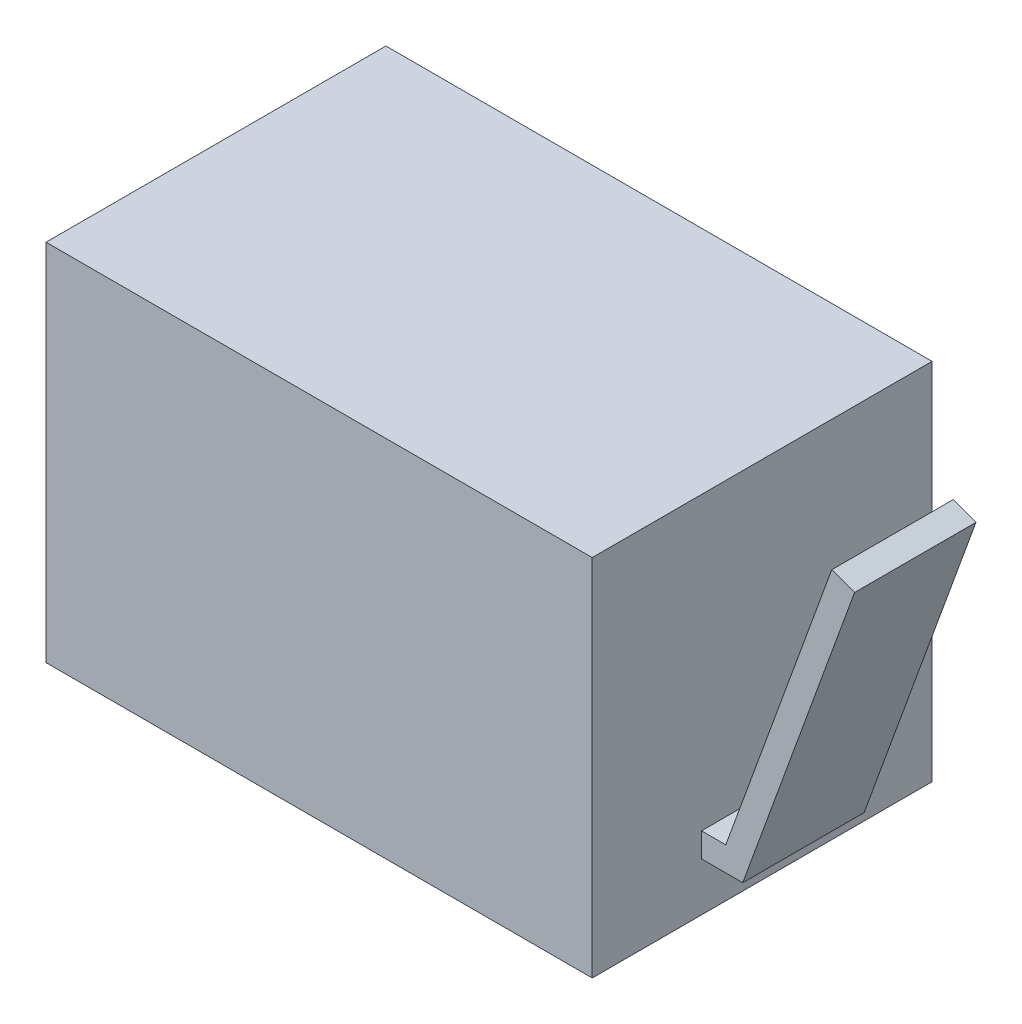
ISO-10303-21;
HEADER;
FILE_DESCRIPTION(('STEP AP214'),'2;1');
FILE_NAME('part.step','',(''),(''),'','','');
FILE_SCHEMA(('AUTOMOTIVE_DESIGN { 1 0 10303 214 1 1 1 1 }'));
ENDSEC;
DATA;
#1=APPLICATION_CONTEXT('core data for automotive mechanical design processes');
#2=APPLICATION_PROTOCOL_DEFINITION('international standard','automotive_design',2000,#1);
#3=PRODUCT_CONTEXT('',#1,'mechanical');
#4=PRODUCT('Part','Part','',(#3));
#5=PRODUCT_RELATED_PRODUCT_CATEGORY('part','',(#4));
#6=PRODUCT_DEFINITION_FORMATION('','',#4);
#7=PRODUCT_DEFINITION_CONTEXT('part definition',#1,'design');
#8=PRODUCT_DEFINITION('design','',#6,#7);
#9=PRODUCT_DEFINITION_SHAPE('','',#8);
#10=(LENGTH_UNIT() NAMED_UNIT(*) SI_UNIT(.MILLI.,.METRE.));
#11=(NAMED_UNIT(*) PLANE_ANGLE_UNIT() SI_UNIT($,.RADIAN.));
#12=(NAMED_UNIT(*) SI_UNIT($,.STERADIAN.) SOLID_ANGLE_UNIT());
#13=UNCERTAINTY_MEASURE_WITH_UNIT(LENGTH_MEASURE(1.E-05),#10,'distance_accuracy_value','');
#14=(GEOMETRIC_REPRESENTATION_CONTEXT(3) GLOBAL_UNCERTAINTY_ASSIGNED_CONTEXT((#13)) GLOBAL_UNIT_ASSIGNED_CONTEXT((#10,
#11,#12)) REPRESENTATION_CONTEXT('',''));
#15=CARTESIAN_POINT('',(0.,0.,0.));
#16=DIRECTION('',(0.,0.,1.));
#17=DIRECTION('',(1.,0.,0.));
#18=AXIS2_PLACEMENT_3D('',#15,#16,#17);
#19=CARTESIAN_POINT('',(22.5,30.,-14.));
#20=DIRECTION('',(-1.,0.,0.));
#21=DIRECTION('',(0.,0.,1.));
#22=AXIS2_PLACEMENT_3D('',#19,#20,#21);
#23=PLANE('',#22);
#24=DIRECTION('',(0.,0.,-1.));
#25=VECTOR('',#24,1.);
#26=CARTESIAN_POINT('',(22.5,0.,-14.));
#27=LINE('',#26,#25);
#28=CARTESIAN_POINT('',(22.5,0.,14.));
#29=VERTEX_POINT('',#28);
#30=CARTESIAN_POINT('',(22.5,0.,-14.));
#31=VERTEX_POINT('',#30);
#32=EDGE_CURVE('E155',#29,#31,#27,.T.);
#33=ORIENTED_EDGE('',*,*,#32,.T.);
#34=DIRECTION('',(0.,-1.,0.));
#35=VECTOR('',#34,1.);
#36=CARTESIAN_POINT('',(22.5,30.,-14.));
#37=LINE('',#36,#35);
#38=CARTESIAN_POINT('',(22.5,30.,-14.));
#39=VERTEX_POINT('',#38);
#40=EDGE_CURVE('E11',#39,#31,#37,.T.);
#41=ORIENTED_EDGE('',*,*,#40,.F.);
#42=DIRECTION('',(0.,0.,-1.));
#43=VECTOR('',#42,1.);
#44=CARTESIAN_POINT('',(22.5,30.,-14.));
#45=LINE('',#44,#43);
#46=CARTESIAN_POINT('',(22.5,30.,14.));
#47=VERTEX_POINT('',#46);
#48=EDGE_CURVE('E148',#47,#39,#45,.T.);
#49=ORIENTED_EDGE('',*,*,#48,.F.);
#50=DIRECTION('',(0.,-1.,0.));
#51=VECTOR('',#50,1.);
#52=CARTESIAN_POINT('',(22.5,30.,14.));
#53=LINE('',#52,#51);
#54=EDGE_CURVE('E154',#47,#29,#53,.T.);
#55=ORIENTED_EDGE('',*,*,#54,.T.);
#56=EDGE_LOOP('',(#33,#41,#49,#55));
#57=FACE_BOUND('',#56,.T.);
#58=DIRECTION('',(0.,-1.,0.));
#59=VECTOR('',#58,1.);
#60=CARTESIAN_POINT('',(22.5,6.,-5.));
#61=LINE('',#60,#59);
#62=CARTESIAN_POINT('',(22.5,6.,-5.));
#63=VERTEX_POINT('',#62);
#64=CARTESIAN_POINT('',(22.5,4.,-5.));
#65=VERTEX_POINT('',#64);
#66=EDGE_CURVE('E138',#63,#65,#61,.T.);
#67=ORIENTED_EDGE('',*,*,#66,.T.);
#68=DIRECTION('',(0.,0.,1.));
#69=VECTOR('',#68,1.);
#70=CARTESIAN_POINT('',(22.5,4.,-5.));
#71=LINE('',#70,#69);
#72=CARTESIAN_POINT('',(22.5,4.,5.));
#73=VERTEX_POINT('',#72);
#74=EDGE_CURVE('E124',#65,#73,#71,.T.);
#75=ORIENTED_EDGE('',*,*,#74,.T.);
#76=DIRECTION('',(0.,-1.,0.));
#77=VECTOR('',#76,1.);
#78=CARTESIAN_POINT('',(22.5,6.,5.));
#79=LINE('',#78,#77);
#80=CARTESIAN_POINT('',(22.5,6.,5.));
#81=VERTEX_POINT('',#80);
#82=EDGE_CURVE('E130',#81,#73,#79,.T.);
#83=ORIENTED_EDGE('',*,*,#82,.F.);
#84=DIRECTION('',(0.,0.,1.));
#85=VECTOR('',#84,1.);
#86=CARTESIAN_POINT('',(22.5,6.,-5.));
#87=LINE('',#86,#85);
#88=EDGE_CURVE('E159',#63,#81,#87,.T.);
#89=ORIENTED_EDGE('',*,*,#88,.F.);
#90=EDGE_LOOP('',(#67,#75,#83,#89));
#91=FACE_BOUND('',#90,.T.);
#92=ADVANCED_FACE('F34',(#57,#91),#23,.F.);
#93=CARTESIAN_POINT('',(-22.5,30.,-14.));
#94=DIRECTION('',(0.,0.,1.));
#95=DIRECTION('',(1.,0.,0.));
#96=AXIS2_PLACEMENT_3D('',#93,#94,#95);
#97=PLANE('',#96);
#98=DIRECTION('',(-1.,0.,0.));
#99=VECTOR('',#98,1.);
#100=CARTESIAN_POINT('',(-22.5,0.,-14.));
#101=LINE('',#100,#99);
#102=CARTESIAN_POINT('',(-22.5,0.,-14.));
#103=VERTEX_POINT('',#102);
#104=EDGE_CURVE('E158',#31,#103,#101,.T.);
#105=ORIENTED_EDGE('',*,*,#104,.T.);
#106=DIRECTION('',(0.,-1.,0.));
#107=VECTOR('',#106,1.);
#108=CARTESIAN_POINT('',(-22.5,30.,-14.));
#109=LINE('',#108,#107);
#110=CARTESIAN_POINT('',(-22.5,30.,-14.));
#111=VERTEX_POINT('',#110);
#112=EDGE_CURVE('E41',#111,#103,#109,.T.);
#113=ORIENTED_EDGE('',*,*,#112,.F.);
#114=DIRECTION('',(-1.,0.,0.));
#115=VECTOR('',#114,1.);
#116=CARTESIAN_POINT('',(-22.5,30.,-14.));
#117=LINE('',#116,#115);
#118=EDGE_CURVE('E85',#39,#111,#117,.T.);
#119=ORIENTED_EDGE('',*,*,#118,.F.);
#120=ORIENTED_EDGE('',*,*,#40,.T.);
#121=EDGE_LOOP('',(#105,#113,#119,#120));
#122=FACE_BOUND('',#121,.T.);
#123=ADVANCED_FACE('F187',(#122),#97,.F.);
#124=CARTESIAN_POINT('',(-22.5,30.,-14.));
#125=DIRECTION('',(1.,0.,0.));
#126=DIRECTION('',(0.,0.,-1.));
#127=AXIS2_PLACEMENT_3D('',#124,#125,#126);
#128=PLANE('',#127);
#129=DIRECTION('',(0.,0.,1.));
#130=VECTOR('',#129,1.);
#131=CARTESIAN_POINT('',(-22.5,0.,-14.));
#132=LINE('',#131,#130);
#133=CARTESIAN_POINT('',(-22.5,0.,14.));
#134=VERTEX_POINT('',#133);
#135=EDGE_CURVE('E161',#103,#134,#132,.T.);
#136=ORIENTED_EDGE('',*,*,#135,.T.);
#137=DIRECTION('',(0.,-1.,0.));
#138=VECTOR('',#137,1.);
#139=CARTESIAN_POINT('',(-22.5,30.,14.));
#140=LINE('',#139,#138);
#141=CARTESIAN_POINT('',(-22.5,30.,14.));
#142=VERTEX_POINT('',#141);
#143=EDGE_CURVE('E165',#142,#134,#140,.T.);
#144=ORIENTED_EDGE('',*,*,#143,.F.);
#145=DIRECTION('',(0.,0.,1.));
#146=VECTOR('',#145,1.);
#147=CARTESIAN_POINT('',(-22.5,30.,-14.));
#148=LINE('',#147,#146);
#149=EDGE_CURVE('E151',#111,#142,#148,.T.);
#150=ORIENTED_EDGE('',*,*,#149,.F.);
#151=ORIENTED_EDGE('',*,*,#112,.T.);
#152=EDGE_LOOP('',(#136,#144,#150,#151));
#153=FACE_BOUND('',#152,.T.);
#154=ADVANCED_FACE('F170',(#153),#128,.F.);
#155=CARTESIAN_POINT('',(-22.5,30.,14.));
#156=DIRECTION('',(0.,0.,-1.));
#157=DIRECTION('',(-1.,0.,0.));
#158=AXIS2_PLACEMENT_3D('',#155,#156,#157);
#159=PLANE('',#158);
#160=DIRECTION('',(1.,0.,0.));
#161=VECTOR('',#160,1.);
#162=CARTESIAN_POINT('',(-22.5,0.,14.));
#163=LINE('',#162,#161);
#164=EDGE_CURVE('E78',#134,#29,#163,.T.);
#165=ORIENTED_EDGE('',*,*,#164,.T.);
#166=ORIENTED_EDGE('',*,*,#54,.F.);
#167=DIRECTION('',(1.,0.,0.));
#168=VECTOR('',#167,1.);
#169=CARTESIAN_POINT('',(-22.5,30.,14.));
#170=LINE('',#169,#168);
#171=EDGE_CURVE('E57',#142,#47,#170,.T.);
#172=ORIENTED_EDGE('',*,*,#171,.F.);
#173=ORIENTED_EDGE('',*,*,#143,.T.);
#174=EDGE_LOOP('',(#165,#166,#172,#173));
#175=FACE_BOUND('',#174,.T.);
#176=ADVANCED_FACE('F178',(#175),#159,.F.);
#177=CARTESIAN_POINT('',(0.,30.,0.));
#178=DIRECTION('',(0.,1.,0.));
#179=DIRECTION('',(0.,0.,1.));
#180=AXIS2_PLACEMENT_3D('',#177,#178,#179);
#181=PLANE('',#180);
#182=ORIENTED_EDGE('',*,*,#48,.T.);
#183=ORIENTED_EDGE('',*,*,#118,.T.);
#184=ORIENTED_EDGE('',*,*,#149,.T.);
#185=ORIENTED_EDGE('',*,*,#171,.T.);
#186=EDGE_LOOP('',(#182,#183,#184,#185));
#187=FACE_BOUND('',#186,.T.);
#188=ADVANCED_FACE('F180',(#187),#181,.T.);
#189=CARTESIAN_POINT('',(0.,0.,0.));
#190=DIRECTION('',(0.,1.,0.));
#191=DIRECTION('',(0.,0.,1.));
#192=AXIS2_PLACEMENT_3D('',#189,#190,#191);
#193=PLANE('',#192);
#194=ORIENTED_EDGE('',*,*,#32,.F.);
#195=ORIENTED_EDGE('',*,*,#164,.F.);
#196=ORIENTED_EDGE('',*,*,#135,.F.);
#197=ORIENTED_EDGE('',*,*,#104,.F.);
#198=EDGE_LOOP('',(#194,#195,#196,#197));
#199=FACE_BOUND('',#198,.T.);
#200=ADVANCED_FACE('F174',(#199),#193,.F.);
#201=CARTESIAN_POINT('',(24.5,6.,-5.));
#202=DIRECTION('',(0.,1.,0.));
#203=DIRECTION('',(0.,0.,1.));
#204=AXIS2_PLACEMENT_3D('',#201,#202,#203);
#205=PLANE('',#204);
#206=ORIENTED_EDGE('',*,*,#88,.T.);
#207=DIRECTION('',(-1.,0.,0.));
#208=VECTOR('',#207,1.);
#209=CARTESIAN_POINT('',(24.5,6.,5.));
#210=LINE('',#209,#208);
#211=CARTESIAN_POINT('',(24.5,6.,5.));
#212=VERTEX_POINT('',#211);
#213=EDGE_CURVE('E48',#212,#81,#210,.T.);
#214=ORIENTED_EDGE('',*,*,#213,.F.);
#215=DIRECTION('',(0.,0.,1.));
#216=VECTOR('',#215,1.);
#217=CARTESIAN_POINT('',(24.5,6.,-5.));
#218=LINE('',#217,#216);
#219=CARTESIAN_POINT('',(24.5,6.,-5.));
#220=VERTEX_POINT('',#219);
#221=EDGE_CURVE('E296',#220,#212,#218,.T.);
#222=ORIENTED_EDGE('',*,*,#221,.F.);
#223=DIRECTION('',(-1.,0.,0.));
#224=VECTOR('',#223,1.);
#225=CARTESIAN_POINT('',(24.5,6.,-5.));
#226=LINE('',#225,#224);
#227=EDGE_CURVE('E139',#220,#63,#226,.T.);
#228=ORIENTED_EDGE('',*,*,#227,.T.);
#229=EDGE_LOOP('',(#206,#214,#222,#228));
#230=FACE_BOUND('',#229,.T.);
#231=ADVANCED_FACE('F218',(#230),#205,.T.);
#232=CARTESIAN_POINT('',(33.2352856223888,30.,-5.));
#233=DIRECTION('',(-0.93969262078591,0.342020143325665,0.));
#234=DIRECTION('',(-0.342020143325665,-0.93969262078591,0.));
#235=AXIS2_PLACEMENT_3D('',#232,#233,#234);
#236=PLANE('',#235);
#237=ORIENTED_EDGE('',*,*,#221,.T.);
#238=DIRECTION('',(-0.342020143325665,-0.939692620785909,0.));
#239=VECTOR('',#238,1.);
#240=CARTESIAN_POINT('',(33.2352856223888,30.,5.));
#241=LINE('',#240,#239);
#242=CARTESIAN_POINT('',(33.2352856223888,30.,5.));
#243=VERTEX_POINT('',#242);
#244=EDGE_CURVE('E312',#243,#212,#241,.T.);
#245=ORIENTED_EDGE('',*,*,#244,.F.);
#246=DIRECTION('',(0.,0.,1.));
#247=VECTOR('',#246,1.);
#248=CARTESIAN_POINT('',(33.2352856223888,30.,-5.));
#249=LINE('',#248,#247);
#250=CARTESIAN_POINT('',(33.2352856223888,30.,-5.));
#251=VERTEX_POINT('',#250);
#252=EDGE_CURVE('E299',#251,#243,#249,.T.);
#253=ORIENTED_EDGE('',*,*,#252,.F.);
#254=DIRECTION('',(-0.342020143325665,-0.939692620785909,0.));
#255=VECTOR('',#254,1.);
#256=CARTESIAN_POINT('',(33.2352856223888,30.,-5.));
#257=LINE('',#256,#255);
#258=EDGE_CURVE('E144',#251,#220,#257,.T.);
#259=ORIENTED_EDGE('',*,*,#258,.T.);
#260=EDGE_LOOP('',(#237,#245,#253,#259));
#261=FACE_BOUND('',#260,.T.);
#262=ADVANCED_FACE('F231',(#261),#236,.T.);
#263=CARTESIAN_POINT('',(35.1146708639606,29.3159597133487,-5.));
#264=DIRECTION('',(0.342020143325665,0.93969262078591,0.));
#265=DIRECTION('',(-0.93969262078591,0.342020143325665,0.));
#266=AXIS2_PLACEMENT_3D('',#263,#264,#265);
#267=PLANE('',#266);
#268=ORIENTED_EDGE('',*,*,#252,.T.);
#269=DIRECTION('',(-0.93969262078591,0.342020143325665,0.));
#270=VECTOR('',#269,1.);
#271=CARTESIAN_POINT('',(35.1146708639606,29.3159597133487,5.));
#272=LINE('',#271,#270);
#273=CARTESIAN_POINT('',(35.1146708639606,29.3159597133487,5.));
#274=VERTEX_POINT('',#273);
#275=EDGE_CURVE('E309',#274,#243,#272,.T.);
#276=ORIENTED_EDGE('',*,*,#275,.F.);
#277=DIRECTION('',(0.,0.,1.));
#278=VECTOR('',#277,1.);
#279=CARTESIAN_POINT('',(35.1146708639606,29.3159597133487,-5.));
#280=LINE('',#279,#278);
#281=CARTESIAN_POINT('',(35.1146708639606,29.3159597133487,-5.));
#282=VERTEX_POINT('',#281);
#283=EDGE_CURVE('E141',#282,#274,#280,.T.);
#284=ORIENTED_EDGE('',*,*,#283,.F.);
#285=DIRECTION('',(-0.93969262078591,0.342020143325665,0.));
#286=VECTOR('',#285,1.);
#287=CARTESIAN_POINT('',(35.1146708639606,29.3159597133487,-5.));
#288=LINE('',#287,#286);
#289=EDGE_CURVE('E319',#282,#251,#288,.T.);
#290=ORIENTED_EDGE('',*,*,#289,.T.);
#291=EDGE_LOOP('',(#268,#276,#284,#290));
#292=FACE_BOUND('',#291,.T.);
#293=ADVANCED_FACE('F241',(#292),#267,.T.);
#294=CARTESIAN_POINT('',(25.9004150764194,4.,-5.));
#295=DIRECTION('',(0.93969262078591,-0.342020143325665,0.));
#296=DIRECTION('',(0.342020143325665,0.93969262078591,0.));
#297=AXIS2_PLACEMENT_3D('',#294,#295,#296);
#298=PLANE('',#297);
#299=ORIENTED_EDGE('',*,*,#283,.T.);
#300=DIRECTION('',(0.342020143325665,0.93969262078591,0.));
#301=VECTOR('',#300,1.);
#302=CARTESIAN_POINT('',(25.9004150764194,4.,5.));
#303=LINE('',#302,#301);
#304=CARTESIAN_POINT('',(25.9004150764194,4.,5.));
#305=VERTEX_POINT('',#304);
#306=EDGE_CURVE('E129',#305,#274,#303,.T.);
#307=ORIENTED_EDGE('',*,*,#306,.F.);
#308=DIRECTION('',(0.,0.,1.));
#309=VECTOR('',#308,1.);
#310=CARTESIAN_POINT('',(25.9004150764194,4.,-5.));
#311=LINE('',#310,#309);
#312=CARTESIAN_POINT('',(25.9004150764194,4.,-5.));
#313=VERTEX_POINT('',#312);
#314=EDGE_CURVE('E126',#313,#305,#311,.T.);
#315=ORIENTED_EDGE('',*,*,#314,.F.);
#316=DIRECTION('',(0.342020143325665,0.93969262078591,0.));
#317=VECTOR('',#316,1.);
#318=CARTESIAN_POINT('',(25.9004150764194,4.,-5.));
#319=LINE('',#318,#317);
#320=EDGE_CURVE('E304',#313,#282,#319,.T.);
#321=ORIENTED_EDGE('',*,*,#320,.T.);
#322=EDGE_LOOP('',(#299,#307,#315,#321));
#323=FACE_BOUND('',#322,.T.);
#324=ADVANCED_FACE('F251',(#323),#298,.T.);
#325=CARTESIAN_POINT('',(22.5,4.,-5.));
#326=DIRECTION('',(0.,-1.,0.));
#327=DIRECTION('',(0.,0.,-1.));
#328=AXIS2_PLACEMENT_3D('',#325,#326,#327);
#329=PLANE('',#328);
#330=ORIENTED_EDGE('',*,*,#314,.T.);
#331=DIRECTION('',(1.,0.,0.));
#332=VECTOR('',#331,1.);
#333=CARTESIAN_POINT('',(22.5,4.,5.));
#334=LINE('',#333,#332);
#335=EDGE_CURVE('E120',#73,#305,#334,.T.);
#336=ORIENTED_EDGE('',*,*,#335,.F.);
#337=ORIENTED_EDGE('',*,*,#74,.F.);
#338=DIRECTION('',(1.,0.,0.));
#339=VECTOR('',#338,1.);
#340=CARTESIAN_POINT('',(22.5,4.,-5.));
#341=LINE('',#340,#339);
#342=EDGE_CURVE('E294',#65,#313,#341,.T.);
#343=ORIENTED_EDGE('',*,*,#342,.T.);
#344=EDGE_LOOP('',(#330,#336,#337,#343));
#345=FACE_BOUND('',#344,.T.);
#346=ADVANCED_FACE('F121',(#345),#329,.T.);
#347=CARTESIAN_POINT('',(0.,0.,-5.));
#348=DIRECTION('',(0.,0.,1.));
#349=DIRECTION('',(1.,0.,0.));
#350=AXIS2_PLACEMENT_3D('',#347,#348,#349);
#351=PLANE('',#350);
#352=ORIENTED_EDGE('',*,*,#66,.F.);
#353=ORIENTED_EDGE('',*,*,#227,.F.);
#354=ORIENTED_EDGE('',*,*,#258,.F.);
#355=ORIENTED_EDGE('',*,*,#289,.F.);
#356=ORIENTED_EDGE('',*,*,#320,.F.);
#357=ORIENTED_EDGE('',*,*,#342,.F.);
#358=EDGE_LOOP('',(#352,#353,#354,#355,#356,#357));
#359=FACE_BOUND('',#358,.T.);
#360=ADVANCED_FACE('F270',(#359),#351,.F.);
#361=CARTESIAN_POINT('',(0.,0.,5.));
#362=DIRECTION('',(0.,0.,1.));
#363=DIRECTION('',(1.,0.,0.));
#364=AXIS2_PLACEMENT_3D('',#361,#362,#363);
#365=PLANE('',#364);
#366=ORIENTED_EDGE('',*,*,#82,.T.);
#367=ORIENTED_EDGE('',*,*,#335,.T.);
#368=ORIENTED_EDGE('',*,*,#306,.T.);
#369=ORIENTED_EDGE('',*,*,#275,.T.);
#370=ORIENTED_EDGE('',*,*,#244,.T.);
#371=ORIENTED_EDGE('',*,*,#213,.T.);
#372=EDGE_LOOP('',(#366,#367,#368,#369,#370,#371));
#373=FACE_BOUND('',#372,.T.);
#374=ADVANCED_FACE('F133',(#373),#365,.T.);
#375=CLOSED_SHELL('',(#92,#123,#154,#176,#188,#200,#231,#262,#293,#324,#346,#360,#374));
#376=MANIFOLD_SOLID_BREP('B2',#375);
#377=ADVANCED_BREP_SHAPE_REPRESENTATION('',(#18,#376),#14);
#378=SHAPE_DEFINITION_REPRESENTATION(#9,#377);
ENDSEC;
END-ISO-10303-21;
